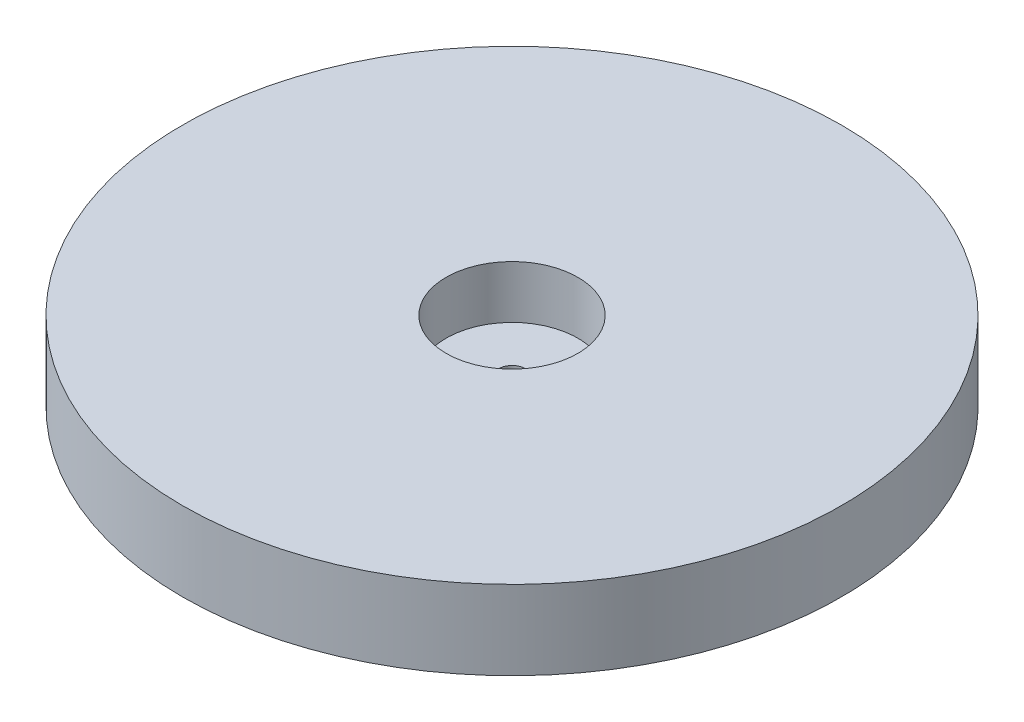
ISO-10303-21;
HEADER;
FILE_DESCRIPTION(('STEP AP214'),'2;1');
FILE_NAME('part.step','',(''),(''),'','','');
FILE_SCHEMA(('AUTOMOTIVE_DESIGN { 1 0 10303 214 1 1 1 1 }'));
ENDSEC;
DATA;
#1=APPLICATION_CONTEXT('core data for automotive mechanical design processes');
#2=APPLICATION_PROTOCOL_DEFINITION('international standard','automotive_design',2000,#1);
#3=PRODUCT_CONTEXT('',#1,'mechanical');
#4=PRODUCT('Part','Part','',(#3));
#5=PRODUCT_RELATED_PRODUCT_CATEGORY('part','',(#4));
#6=PRODUCT_DEFINITION_FORMATION('','',#4);
#7=PRODUCT_DEFINITION_CONTEXT('part definition',#1,'design');
#8=PRODUCT_DEFINITION('design','',#6,#7);
#9=PRODUCT_DEFINITION_SHAPE('','',#8);
#10=(LENGTH_UNIT() NAMED_UNIT(*) SI_UNIT(.MILLI.,.METRE.));
#11=(NAMED_UNIT(*) PLANE_ANGLE_UNIT() SI_UNIT($,.RADIAN.));
#12=(NAMED_UNIT(*) SI_UNIT($,.STERADIAN.) SOLID_ANGLE_UNIT());
#13=UNCERTAINTY_MEASURE_WITH_UNIT(LENGTH_MEASURE(1.E-05),#10,'distance_accuracy_value','');
#14=(GEOMETRIC_REPRESENTATION_CONTEXT(3) GLOBAL_UNCERTAINTY_ASSIGNED_CONTEXT((#13)) GLOBAL_UNIT_ASSIGNED_CONTEXT((#10,
#11,#12)) REPRESENTATION_CONTEXT('',''));
#15=CARTESIAN_POINT('',(0.,0.,0.));
#16=DIRECTION('',(0.,0.,1.));
#17=DIRECTION('',(1.,0.,0.));
#18=AXIS2_PLACEMENT_3D('',#15,#16,#17);
#19=CARTESIAN_POINT('',(0.,12.,0.));
#20=DIRECTION('',(0.,-1.,0.));
#21=DIRECTION('',(0.,0.,-1.));
#22=AXIS2_PLACEMENT_3D('',#19,#20,#21);
#23=CYLINDRICAL_SURFACE('',#22,50.);
#24=CARTESIAN_POINT('',(0.,12.,0.));
#25=DIRECTION('',(0.,1.,0.));
#26=DIRECTION('',(0.,0.,1.));
#27=AXIS2_PLACEMENT_3D('',#24,#25,#26);
#28=CIRCLE('',#27,50.);
#29=CARTESIAN_POINT('',(0.,12.,50.));
#30=VERTEX_POINT('',#29);
#31=EDGE_CURVE('E10',#30,#30,#28,.T.);
#32=ORIENTED_EDGE('',*,*,#31,.F.);
#33=EDGE_LOOP('',(#32));
#34=FACE_BOUND('',#33,.T.);
#35=CARTESIAN_POINT('',(0.,0.,0.));
#36=DIRECTION('',(0.,1.,0.));
#37=DIRECTION('',(0.,0.,1.));
#38=AXIS2_PLACEMENT_3D('',#35,#36,#37);
#39=CIRCLE('',#38,50.);
#40=CARTESIAN_POINT('',(0.,0.,50.));
#41=VERTEX_POINT('',#40);
#42=EDGE_CURVE('E38',#41,#41,#39,.T.);
#43=ORIENTED_EDGE('',*,*,#42,.T.);
#44=EDGE_LOOP('',(#43));
#45=FACE_BOUND('',#44,.T.);
#46=ADVANCED_FACE('F31',(#34,#45),#23,.T.);
#47=CARTESIAN_POINT('',(0.,12.,0.));
#48=DIRECTION('',(0.,1.,0.));
#49=DIRECTION('',(0.,0.,1.));
#50=AXIS2_PLACEMENT_3D('',#47,#48,#49);
#51=PLANE('',#50);
#52=CARTESIAN_POINT('',(0.,12.,0.));
#53=DIRECTION('',(0.,1.,0.));
#54=DIRECTION('',(0.,0.,1.));
#55=AXIS2_PLACEMENT_3D('',#52,#53,#54);
#56=CIRCLE('',#55,10.);
#57=CARTESIAN_POINT('',(0.,12.,10.));
#58=VERTEX_POINT('',#57);
#59=EDGE_CURVE('E45',#58,#58,#56,.T.);
#60=ORIENTED_EDGE('',*,*,#59,.F.);
#61=EDGE_LOOP('',(#60));
#62=FACE_BOUND('',#61,.T.);
#63=ORIENTED_EDGE('',*,*,#31,.T.);
#64=EDGE_LOOP('',(#63));
#65=FACE_BOUND('',#64,.T.);
#66=ADVANCED_FACE('F73',(#62,#65),#51,.T.);
#67=CARTESIAN_POINT('',(0.,0.,0.));
#68=DIRECTION('',(0.,1.,0.));
#69=DIRECTION('',(0.,0.,1.));
#70=AXIS2_PLACEMENT_3D('',#67,#68,#69);
#71=PLANE('',#70);
#72=CARTESIAN_POINT('',(0.,0.,0.));
#73=DIRECTION('',(0.,1.,0.));
#74=DIRECTION('',(0.,0.,1.));
#75=AXIS2_PLACEMENT_3D('',#72,#73,#74);
#76=CIRCLE('',#75,2.);
#77=CARTESIAN_POINT('',(0.,0.,2.));
#78=VERTEX_POINT('',#77);
#79=EDGE_CURVE('E50',#78,#78,#76,.T.);
#80=ORIENTED_EDGE('',*,*,#79,.T.);
#81=EDGE_LOOP('',(#80));
#82=FACE_BOUND('',#81,.T.);
#83=ORIENTED_EDGE('',*,*,#42,.F.);
#84=EDGE_LOOP('',(#83));
#85=FACE_BOUND('',#84,.T.);
#86=ADVANCED_FACE('F69',(#82,#85),#71,.F.);
#87=CARTESIAN_POINT('',(0.,4.,0.));
#88=DIRECTION('',(0.,1.,0.));
#89=DIRECTION('',(0.,0.,1.));
#90=AXIS2_PLACEMENT_3D('',#87,#88,#89);
#91=CYLINDRICAL_SURFACE('',#90,10.);
#92=CARTESIAN_POINT('',(0.,4.,0.));
#93=DIRECTION('',(0.,1.,0.));
#94=DIRECTION('',(0.,0.,1.));
#95=AXIS2_PLACEMENT_3D('',#92,#93,#94);
#96=CIRCLE('',#95,10.);
#97=CARTESIAN_POINT('',(0.,4.,10.));
#98=VERTEX_POINT('',#97);
#99=EDGE_CURVE('E43',#98,#98,#96,.T.);
#100=ORIENTED_EDGE('',*,*,#99,.F.);
#101=EDGE_LOOP('',(#100));
#102=FACE_BOUND('',#101,.T.);
#103=ORIENTED_EDGE('',*,*,#59,.T.);
#104=EDGE_LOOP('',(#103));
#105=FACE_BOUND('',#104,.T.);
#106=ADVANCED_FACE('F63',(#102,#105),#91,.F.);
#107=CARTESIAN_POINT('',(0.,4.,0.));
#108=DIRECTION('',(0.,1.,0.));
#109=DIRECTION('',(0.,0.,1.));
#110=AXIS2_PLACEMENT_3D('',#107,#108,#109);
#111=PLANE('',#110);
#112=CARTESIAN_POINT('',(0.,4.,0.));
#113=DIRECTION('',(0.,1.,0.));
#114=DIRECTION('',(0.,0.,1.));
#115=AXIS2_PLACEMENT_3D('',#112,#113,#114);
#116=CIRCLE('',#115,2.);
#117=CARTESIAN_POINT('',(0.,4.,2.));
#118=VERTEX_POINT('',#117);
#119=EDGE_CURVE('E34',#118,#118,#116,.T.);
#120=ORIENTED_EDGE('',*,*,#119,.F.);
#121=EDGE_LOOP('',(#120));
#122=FACE_BOUND('',#121,.T.);
#123=ORIENTED_EDGE('',*,*,#99,.T.);
#124=EDGE_LOOP('',(#123));
#125=FACE_BOUND('',#124,.T.);
#126=ADVANCED_FACE('F60',(#122,#125),#111,.T.);
#127=CARTESIAN_POINT('',(0.,0.,0.));
#128=DIRECTION('',(0.,1.,0.));
#129=DIRECTION('',(0.,0.,1.));
#130=AXIS2_PLACEMENT_3D('',#127,#128,#129);
#131=CYLINDRICAL_SURFACE('',#130,2.);
#132=ORIENTED_EDGE('',*,*,#119,.T.);
#133=EDGE_LOOP('',(#132));
#134=FACE_BOUND('',#133,.T.);
#135=ORIENTED_EDGE('',*,*,#79,.F.);
#136=EDGE_LOOP('',(#135));
#137=FACE_BOUND('',#136,.T.);
#138=ADVANCED_FACE('F57',(#134,#137),#131,.F.);
#139=CLOSED_SHELL('',(#46,#66,#86,#106,#126,#138));
#140=MANIFOLD_SOLID_BREP('B2',#139);
#141=ADVANCED_BREP_SHAPE_REPRESENTATION('',(#18,#140),#14);
#142=SHAPE_DEFINITION_REPRESENTATION(#9,#141);
ENDSEC;
END-ISO-10303-21;
